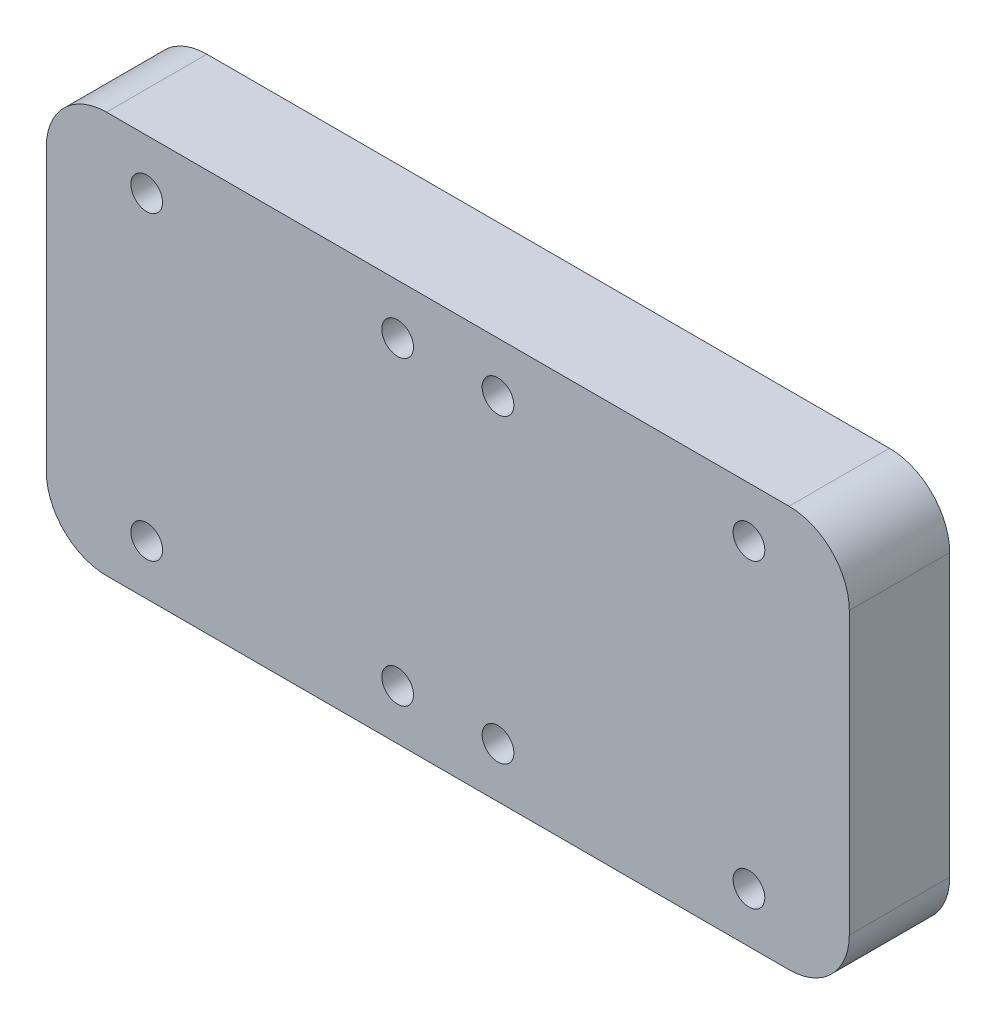
ISO-10303-21;
HEADER;
FILE_DESCRIPTION(('STEP AP214'),'2;1');
FILE_NAME('part.step','',(''),(''),'','','');
FILE_SCHEMA(('AUTOMOTIVE_DESIGN { 1 0 10303 214 1 1 1 1 }'));
ENDSEC;
DATA;
#1=APPLICATION_CONTEXT('core data for automotive mechanical design processes');
#2=APPLICATION_PROTOCOL_DEFINITION('international standard','automotive_design',2000,#1);
#3=PRODUCT_CONTEXT('',#1,'mechanical');
#4=PRODUCT('Part','Part','',(#3));
#5=PRODUCT_RELATED_PRODUCT_CATEGORY('part','',(#4));
#6=PRODUCT_DEFINITION_FORMATION('','',#4);
#7=PRODUCT_DEFINITION_CONTEXT('part definition',#1,'design');
#8=PRODUCT_DEFINITION('design','',#6,#7);
#9=PRODUCT_DEFINITION_SHAPE('','',#8);
#10=(LENGTH_UNIT() NAMED_UNIT(*) SI_UNIT(.MILLI.,.METRE.));
#11=(NAMED_UNIT(*) PLANE_ANGLE_UNIT() SI_UNIT($,.RADIAN.));
#12=(NAMED_UNIT(*) SI_UNIT($,.STERADIAN.) SOLID_ANGLE_UNIT());
#13=UNCERTAINTY_MEASURE_WITH_UNIT(LENGTH_MEASURE(1.E-05),#10,'distance_accuracy_value','');
#14=(GEOMETRIC_REPRESENTATION_CONTEXT(3) GLOBAL_UNCERTAINTY_ASSIGNED_CONTEXT((#13)) GLOBAL_UNIT_ASSIGNED_CONTEXT((#10,
#11,#12)) REPRESENTATION_CONTEXT('',''));
#15=CARTESIAN_POINT('',(0.,0.,0.));
#16=DIRECTION('',(0.,0.,1.));
#17=DIRECTION('',(1.,0.,0.));
#18=AXIS2_PLACEMENT_3D('',#15,#16,#17);
#19=CARTESIAN_POINT('',(0.,0.,5.));
#20=DIRECTION('',(1.,0.,0.));
#21=DIRECTION('',(0.,0.,-1.));
#22=AXIS2_PLACEMENT_3D('',#19,#20,#21);
#23=PLANE('',#22);
#24=DIRECTION('',(0.,-1.,0.));
#25=VECTOR('',#24,1.);
#26=CARTESIAN_POINT('',(0.,0.,0.));
#27=LINE('',#26,#25);
#28=CARTESIAN_POINT('',(0.,17.,0.));
#29=VERTEX_POINT('',#28);
#30=CARTESIAN_POINT('',(0.,3.,0.));
#31=VERTEX_POINT('',#30);
#32=EDGE_CURVE('E128',#29,#31,#27,.T.);
#33=ORIENTED_EDGE('',*,*,#32,.T.);
#34=DIRECTION('',(0.,0.,-1.));
#35=VECTOR('',#34,1.);
#36=CARTESIAN_POINT('',(0.,3.,5.));
#37=LINE('',#36,#35);
#38=CARTESIAN_POINT('',(0.,3.,5.));
#39=VERTEX_POINT('',#38);
#40=EDGE_CURVE('E105',#31,#39,#37,.F.);
#41=ORIENTED_EDGE('',*,*,#40,.T.);
#42=DIRECTION('',(0.,-1.,0.));
#43=VECTOR('',#42,1.);
#44=CARTESIAN_POINT('',(0.,0.,5.));
#45=LINE('',#44,#43);
#46=CARTESIAN_POINT('',(0.,17.,5.));
#47=VERTEX_POINT('',#46);
#48=EDGE_CURVE('E138',#47,#39,#45,.T.);
#49=ORIENTED_EDGE('',*,*,#48,.F.);
#50=DIRECTION('',(0.,0.,-1.));
#51=VECTOR('',#50,1.);
#52=CARTESIAN_POINT('',(0.,17.,5.));
#53=LINE('',#52,#51);
#54=EDGE_CURVE('E110',#47,#29,#53,.T.);
#55=ORIENTED_EDGE('',*,*,#54,.T.);
#56=EDGE_LOOP('',(#33,#41,#49,#55));
#57=FACE_BOUND('',#56,.T.);
#58=ADVANCED_FACE('F33',(#57),#23,.F.);
#59=CARTESIAN_POINT('',(0.,0.,5.));
#60=DIRECTION('',(0.,1.,0.));
#61=DIRECTION('',(0.,0.,1.));
#62=AXIS2_PLACEMENT_3D('',#59,#60,#61);
#63=PLANE('',#62);
#64=DIRECTION('',(1.,0.,0.));
#65=VECTOR('',#64,1.);
#66=CARTESIAN_POINT('',(0.,0.,5.));
#67=LINE('',#66,#65);
#68=CARTESIAN_POINT('',(3.,0.,5.));
#69=VERTEX_POINT('',#68);
#70=CARTESIAN_POINT('',(37.,0.,5.));
#71=VERTEX_POINT('',#70);
#72=EDGE_CURVE('E120',#69,#71,#67,.T.);
#73=ORIENTED_EDGE('',*,*,#72,.F.);
#74=DIRECTION('',(0.,0.,-1.));
#75=VECTOR('',#74,1.);
#76=CARTESIAN_POINT('',(3.,0.,5.));
#77=LINE('',#76,#75);
#78=CARTESIAN_POINT('',(3.,0.,0.));
#79=VERTEX_POINT('',#78);
#80=EDGE_CURVE('E104',#69,#79,#77,.T.);
#81=ORIENTED_EDGE('',*,*,#80,.T.);
#82=DIRECTION('',(1.,0.,0.));
#83=VECTOR('',#82,1.);
#84=CARTESIAN_POINT('',(0.,0.,0.));
#85=LINE('',#84,#83);
#86=CARTESIAN_POINT('',(37.,0.,0.));
#87=VERTEX_POINT('',#86);
#88=EDGE_CURVE('E117',#79,#87,#85,.T.);
#89=ORIENTED_EDGE('',*,*,#88,.T.);
#90=DIRECTION('',(0.,0.,-1.));
#91=VECTOR('',#90,1.);
#92=CARTESIAN_POINT('',(37.,0.,5.));
#93=LINE('',#92,#91);
#94=EDGE_CURVE('E122',#87,#71,#93,.F.);
#95=ORIENTED_EDGE('',*,*,#94,.T.);
#96=EDGE_LOOP('',(#73,#81,#89,#95));
#97=FACE_BOUND('',#96,.T.);
#98=ADVANCED_FACE('F116',(#97),#63,.F.);
#99=CARTESIAN_POINT('',(40.,0.,5.));
#100=DIRECTION('',(-1.,0.,0.));
#101=DIRECTION('',(0.,0.,1.));
#102=AXIS2_PLACEMENT_3D('',#99,#100,#101);
#103=PLANE('',#102);
#104=DIRECTION('',(0.,1.,0.));
#105=VECTOR('',#104,1.);
#106=CARTESIAN_POINT('',(40.,0.,5.));
#107=LINE('',#106,#105);
#108=CARTESIAN_POINT('',(40.,3.,5.));
#109=VERTEX_POINT('',#108);
#110=CARTESIAN_POINT('',(40.,17.,5.));
#111=VERTEX_POINT('',#110);
#112=EDGE_CURVE('E161',#109,#111,#107,.T.);
#113=ORIENTED_EDGE('',*,*,#112,.F.);
#114=DIRECTION('',(0.,0.,-1.));
#115=VECTOR('',#114,1.);
#116=CARTESIAN_POINT('',(40.,3.,5.));
#117=LINE('',#116,#115);
#118=CARTESIAN_POINT('',(40.,3.,0.));
#119=VERTEX_POINT('',#118);
#120=EDGE_CURVE('E11',#109,#119,#117,.T.);
#121=ORIENTED_EDGE('',*,*,#120,.T.);
#122=DIRECTION('',(0.,1.,0.));
#123=VECTOR('',#122,1.);
#124=CARTESIAN_POINT('',(40.,0.,0.));
#125=LINE('',#124,#123);
#126=CARTESIAN_POINT('',(40.,17.,0.));
#127=VERTEX_POINT('',#126);
#128=EDGE_CURVE('E127',#119,#127,#125,.T.);
#129=ORIENTED_EDGE('',*,*,#128,.T.);
#130=DIRECTION('',(0.,0.,-1.));
#131=VECTOR('',#130,1.);
#132=CARTESIAN_POINT('',(40.,17.,5.));
#133=LINE('',#132,#131);
#134=EDGE_CURVE('E41',#127,#111,#133,.F.);
#135=ORIENTED_EDGE('',*,*,#134,.T.);
#136=EDGE_LOOP('',(#113,#121,#129,#135));
#137=FACE_BOUND('',#136,.T.);
#138=ADVANCED_FACE('F160',(#137),#103,.F.);
#139=CARTESIAN_POINT('',(0.,20.,5.));
#140=DIRECTION('',(0.,-1.,0.));
#141=DIRECTION('',(0.,0.,-1.));
#142=AXIS2_PLACEMENT_3D('',#139,#140,#141);
#143=PLANE('',#142);
#144=DIRECTION('',(-1.,0.,0.));
#145=VECTOR('',#144,1.);
#146=CARTESIAN_POINT('',(0.,20.,0.));
#147=LINE('',#146,#145);
#148=CARTESIAN_POINT('',(37.,20.,0.));
#149=VERTEX_POINT('',#148);
#150=CARTESIAN_POINT('',(3.,20.,0.));
#151=VERTEX_POINT('',#150);
#152=EDGE_CURVE('E131',#149,#151,#147,.T.);
#153=ORIENTED_EDGE('',*,*,#152,.T.);
#154=DIRECTION('',(0.,0.,-1.));
#155=VECTOR('',#154,1.);
#156=CARTESIAN_POINT('',(3.,20.,5.));
#157=LINE('',#156,#155);
#158=CARTESIAN_POINT('',(3.,20.,5.));
#159=VERTEX_POINT('',#158);
#160=EDGE_CURVE('E48',#151,#159,#157,.F.);
#161=ORIENTED_EDGE('',*,*,#160,.T.);
#162=DIRECTION('',(-1.,0.,0.));
#163=VECTOR('',#162,1.);
#164=CARTESIAN_POINT('',(0.,20.,5.));
#165=LINE('',#164,#163);
#166=CARTESIAN_POINT('',(37.,20.,5.));
#167=VERTEX_POINT('',#166);
#168=EDGE_CURVE('E139',#167,#159,#165,.T.);
#169=ORIENTED_EDGE('',*,*,#168,.F.);
#170=DIRECTION('',(0.,0.,-1.));
#171=VECTOR('',#170,1.);
#172=CARTESIAN_POINT('',(37.,20.,5.));
#173=LINE('',#172,#171);
#174=EDGE_CURVE('E154',#167,#149,#173,.T.);
#175=ORIENTED_EDGE('',*,*,#174,.T.);
#176=EDGE_LOOP('',(#153,#161,#169,#175));
#177=FACE_BOUND('',#176,.T.);
#178=ADVANCED_FACE('F170',(#177),#143,.F.);
#179=CARTESIAN_POINT('',(0.,0.,5.));
#180=DIRECTION('',(0.,0.,-1.));
#181=DIRECTION('',(-1.,0.,0.));
#182=AXIS2_PLACEMENT_3D('',#179,#180,#181);
#183=PLANE('',#182);
#184=CARTESIAN_POINT('',(5.,2.5,5.));
#185=DIRECTION('',(0.,0.,1.));
#186=DIRECTION('',(1.,0.,0.));
#187=AXIS2_PLACEMENT_3D('',#184,#185,#186);
#188=CIRCLE('',#187,0.79);
#189=CARTESIAN_POINT('',(5.79,2.5,5.));
#190=VERTEX_POINT('',#189);
#191=EDGE_CURVE('E222',#190,#190,#188,.T.);
#192=ORIENTED_EDGE('',*,*,#191,.F.);
#193=EDGE_LOOP('',(#192));
#194=FACE_BOUND('',#193,.T.);
#195=CARTESIAN_POINT('',(17.5,2.50000000000001,5.));
#196=DIRECTION('',(0.,0.,1.));
#197=DIRECTION('',(1.,0.,0.));
#198=AXIS2_PLACEMENT_3D('',#195,#196,#197);
#199=CIRCLE('',#198,0.789999999999999);
#200=CARTESIAN_POINT('',(18.29,2.50000000000001,5.));
#201=VERTEX_POINT('',#200);
#202=EDGE_CURVE('E216',#201,#201,#199,.T.);
#203=ORIENTED_EDGE('',*,*,#202,.F.);
#204=EDGE_LOOP('',(#203));
#205=FACE_BOUND('',#204,.T.);
#206=CARTESIAN_POINT('',(17.5,17.5,5.));
#207=DIRECTION('',(0.,0.,1.));
#208=DIRECTION('',(1.,0.,0.));
#209=AXIS2_PLACEMENT_3D('',#206,#207,#208);
#210=CIRCLE('',#209,0.789999999999999);
#211=CARTESIAN_POINT('',(18.29,17.5,5.));
#212=VERTEX_POINT('',#211);
#213=EDGE_CURVE('E210',#212,#212,#210,.T.);
#214=ORIENTED_EDGE('',*,*,#213,.F.);
#215=EDGE_LOOP('',(#214));
#216=FACE_BOUND('',#215,.T.);
#217=CARTESIAN_POINT('',(22.5,17.5,5.));
#218=DIRECTION('',(0.,0.,1.));
#219=DIRECTION('',(-1.,0.,0.));
#220=AXIS2_PLACEMENT_3D('',#217,#218,#219);
#221=CIRCLE('',#220,0.789999999999999);
#222=CARTESIAN_POINT('',(21.71,17.5,5.));
#223=VERTEX_POINT('',#222);
#224=EDGE_CURVE('E204',#223,#223,#221,.T.);
#225=ORIENTED_EDGE('',*,*,#224,.F.);
#226=EDGE_LOOP('',(#225));
#227=FACE_BOUND('',#226,.T.);
#228=CARTESIAN_POINT('',(22.5,2.50000000000001,5.));
#229=DIRECTION('',(0.,0.,1.));
#230=DIRECTION('',(-1.,0.,0.));
#231=AXIS2_PLACEMENT_3D('',#228,#229,#230);
#232=CIRCLE('',#231,0.789999999999999);
#233=CARTESIAN_POINT('',(21.71,2.50000000000001,5.));
#234=VERTEX_POINT('',#233);
#235=EDGE_CURVE('E198',#234,#234,#232,.T.);
#236=ORIENTED_EDGE('',*,*,#235,.F.);
#237=EDGE_LOOP('',(#236));
#238=FACE_BOUND('',#237,.T.);
#239=CARTESIAN_POINT('',(35.,2.5,5.));
#240=DIRECTION('',(0.,0.,1.));
#241=DIRECTION('',(-1.,0.,0.));
#242=AXIS2_PLACEMENT_3D('',#239,#240,#241);
#243=CIRCLE('',#242,0.789999999999999);
#244=CARTESIAN_POINT('',(34.21,2.5,5.));
#245=VERTEX_POINT('',#244);
#246=EDGE_CURVE('E192',#245,#245,#243,.T.);
#247=ORIENTED_EDGE('',*,*,#246,.F.);
#248=EDGE_LOOP('',(#247));
#249=FACE_BOUND('',#248,.T.);
#250=CARTESIAN_POINT('',(35.,17.5,5.));
#251=DIRECTION('',(0.,0.,1.));
#252=DIRECTION('',(-1.,0.,0.));
#253=AXIS2_PLACEMENT_3D('',#250,#251,#252);
#254=CIRCLE('',#253,0.789999999999999);
#255=CARTESIAN_POINT('',(34.21,17.5,5.));
#256=VERTEX_POINT('',#255);
#257=EDGE_CURVE('E186',#256,#256,#254,.T.);
#258=ORIENTED_EDGE('',*,*,#257,.F.);
#259=EDGE_LOOP('',(#258));
#260=FACE_BOUND('',#259,.T.);
#261=CARTESIAN_POINT('',(5.,17.5,5.));
#262=DIRECTION('',(0.,0.,1.));
#263=DIRECTION('',(1.,0.,0.));
#264=AXIS2_PLACEMENT_3D('',#261,#262,#263);
#265=CIRCLE('',#264,0.79);
#266=CARTESIAN_POINT('',(5.79,17.5,5.));
#267=VERTEX_POINT('',#266);
#268=EDGE_CURVE('E180',#267,#267,#265,.T.);
#269=ORIENTED_EDGE('',*,*,#268,.F.);
#270=EDGE_LOOP('',(#269));
#271=FACE_BOUND('',#270,.T.);
#272=ORIENTED_EDGE('',*,*,#48,.T.);
#273=CARTESIAN_POINT('',(3.,3.,5.));
#274=DIRECTION('',(0.,0.,-1.));
#275=DIRECTION('',(-1.,0.,0.));
#276=AXIS2_PLACEMENT_3D('',#273,#274,#275);
#277=CIRCLE('',#276,3.);
#278=EDGE_CURVE('E152',#39,#69,#277,.F.);
#279=ORIENTED_EDGE('',*,*,#278,.T.);
#280=ORIENTED_EDGE('',*,*,#72,.T.);
#281=CARTESIAN_POINT('',(37.,3.,5.));
#282=DIRECTION('',(0.,0.,-1.));
#283=DIRECTION('',(-1.,0.,0.));
#284=AXIS2_PLACEMENT_3D('',#281,#282,#283);
#285=CIRCLE('',#284,3.);
#286=EDGE_CURVE('E148',#71,#109,#285,.F.);
#287=ORIENTED_EDGE('',*,*,#286,.T.);
#288=ORIENTED_EDGE('',*,*,#112,.T.);
#289=CARTESIAN_POINT('',(37.,17.,5.));
#290=DIRECTION('',(0.,0.,-1.));
#291=DIRECTION('',(-1.,0.,0.));
#292=AXIS2_PLACEMENT_3D('',#289,#290,#291);
#293=CIRCLE('',#292,3.);
#294=EDGE_CURVE('E55',#111,#167,#293,.F.);
#295=ORIENTED_EDGE('',*,*,#294,.T.);
#296=ORIENTED_EDGE('',*,*,#168,.T.);
#297=CARTESIAN_POINT('',(3.,17.,5.));
#298=DIRECTION('',(0.,0.,-1.));
#299=DIRECTION('',(-1.,0.,0.));
#300=AXIS2_PLACEMENT_3D('',#297,#298,#299);
#301=CIRCLE('',#300,3.);
#302=EDGE_CURVE('E150',#159,#47,#301,.F.);
#303=ORIENTED_EDGE('',*,*,#302,.T.);
#304=EDGE_LOOP('',(#272,#279,#280,#287,#288,#295,#296,#303));
#305=FACE_BOUND('',#304,.T.);
#306=ADVANCED_FACE('F165',(#194,#205,#216,#227,#238,#249,#260,#271,#305),#183,.F.);
#307=CARTESIAN_POINT('',(0.,0.,0.));
#308=DIRECTION('',(0.,0.,-1.));
#309=DIRECTION('',(-1.,0.,0.));
#310=AXIS2_PLACEMENT_3D('',#307,#308,#309);
#311=PLANE('',#310);
#312=CARTESIAN_POINT('',(5.,2.5,0.));
#313=DIRECTION('',(0.,0.,1.));
#314=DIRECTION('',(1.,0.,0.));
#315=AXIS2_PLACEMENT_3D('',#312,#313,#314);
#316=CIRCLE('',#315,0.79);
#317=CARTESIAN_POINT('',(5.79,2.5,0.));
#318=VERTEX_POINT('',#317);
#319=EDGE_CURVE('E183',#318,#318,#316,.T.);
#320=ORIENTED_EDGE('',*,*,#319,.T.);
#321=EDGE_LOOP('',(#320));
#322=FACE_BOUND('',#321,.T.);
#323=CARTESIAN_POINT('',(17.5,2.50000000000001,0.));
#324=DIRECTION('',(0.,0.,1.));
#325=DIRECTION('',(1.,0.,0.));
#326=AXIS2_PLACEMENT_3D('',#323,#324,#325);
#327=CIRCLE('',#326,0.789999999999999);
#328=CARTESIAN_POINT('',(18.29,2.50000000000001,0.));
#329=VERTEX_POINT('',#328);
#330=EDGE_CURVE('E219',#329,#329,#327,.T.);
#331=ORIENTED_EDGE('',*,*,#330,.T.);
#332=EDGE_LOOP('',(#331));
#333=FACE_BOUND('',#332,.T.);
#334=CARTESIAN_POINT('',(17.5,17.5,0.));
#335=DIRECTION('',(0.,0.,1.));
#336=DIRECTION('',(1.,0.,0.));
#337=AXIS2_PLACEMENT_3D('',#334,#335,#336);
#338=CIRCLE('',#337,0.789999999999999);
#339=CARTESIAN_POINT('',(18.29,17.5,0.));
#340=VERTEX_POINT('',#339);
#341=EDGE_CURVE('E213',#340,#340,#338,.T.);
#342=ORIENTED_EDGE('',*,*,#341,.T.);
#343=EDGE_LOOP('',(#342));
#344=FACE_BOUND('',#343,.T.);
#345=CARTESIAN_POINT('',(22.5,17.5,0.));
#346=DIRECTION('',(0.,0.,1.));
#347=DIRECTION('',(-1.,0.,0.));
#348=AXIS2_PLACEMENT_3D('',#345,#346,#347);
#349=CIRCLE('',#348,0.789999999999999);
#350=CARTESIAN_POINT('',(21.71,17.5,0.));
#351=VERTEX_POINT('',#350);
#352=EDGE_CURVE('E207',#351,#351,#349,.T.);
#353=ORIENTED_EDGE('',*,*,#352,.T.);
#354=EDGE_LOOP('',(#353));
#355=FACE_BOUND('',#354,.T.);
#356=CARTESIAN_POINT('',(22.5,2.50000000000001,0.));
#357=DIRECTION('',(0.,0.,1.));
#358=DIRECTION('',(-1.,0.,0.));
#359=AXIS2_PLACEMENT_3D('',#356,#357,#358);
#360=CIRCLE('',#359,0.789999999999999);
#361=CARTESIAN_POINT('',(21.71,2.50000000000001,0.));
#362=VERTEX_POINT('',#361);
#363=EDGE_CURVE('E201',#362,#362,#360,.T.);
#364=ORIENTED_EDGE('',*,*,#363,.T.);
#365=EDGE_LOOP('',(#364));
#366=FACE_BOUND('',#365,.T.);
#367=CARTESIAN_POINT('',(35.,2.5,0.));
#368=DIRECTION('',(0.,0.,1.));
#369=DIRECTION('',(-1.,0.,0.));
#370=AXIS2_PLACEMENT_3D('',#367,#368,#369);
#371=CIRCLE('',#370,0.789999999999999);
#372=CARTESIAN_POINT('',(34.21,2.5,0.));
#373=VERTEX_POINT('',#372);
#374=EDGE_CURVE('E195',#373,#373,#371,.T.);
#375=ORIENTED_EDGE('',*,*,#374,.T.);
#376=EDGE_LOOP('',(#375));
#377=FACE_BOUND('',#376,.T.);
#378=CARTESIAN_POINT('',(35.,17.5,0.));
#379=DIRECTION('',(0.,0.,1.));
#380=DIRECTION('',(-1.,0.,0.));
#381=AXIS2_PLACEMENT_3D('',#378,#379,#380);
#382=CIRCLE('',#381,0.789999999999999);
#383=CARTESIAN_POINT('',(34.21,17.5,0.));
#384=VERTEX_POINT('',#383);
#385=EDGE_CURVE('E189',#384,#384,#382,.T.);
#386=ORIENTED_EDGE('',*,*,#385,.T.);
#387=EDGE_LOOP('',(#386));
#388=FACE_BOUND('',#387,.T.);
#389=CARTESIAN_POINT('',(5.,17.5,0.));
#390=DIRECTION('',(0.,0.,1.));
#391=DIRECTION('',(1.,0.,0.));
#392=AXIS2_PLACEMENT_3D('',#389,#390,#391);
#393=CIRCLE('',#392,0.79);
#394=CARTESIAN_POINT('',(5.79,17.5,0.));
#395=VERTEX_POINT('',#394);
#396=EDGE_CURVE('E133',#395,#395,#393,.T.);
#397=ORIENTED_EDGE('',*,*,#396,.T.);
#398=EDGE_LOOP('',(#397));
#399=FACE_BOUND('',#398,.T.);
#400=ORIENTED_EDGE('',*,*,#88,.F.);
#401=CARTESIAN_POINT('',(3.,3.,0.));
#402=DIRECTION('',(0.,0.,-1.));
#403=DIRECTION('',(-1.,0.,0.));
#404=AXIS2_PLACEMENT_3D('',#401,#402,#403);
#405=CIRCLE('',#404,3.);
#406=EDGE_CURVE('E100',#79,#31,#405,.T.);
#407=ORIENTED_EDGE('',*,*,#406,.T.);
#408=ORIENTED_EDGE('',*,*,#32,.F.);
#409=CARTESIAN_POINT('',(3.,17.,0.));
#410=DIRECTION('',(0.,0.,-1.));
#411=DIRECTION('',(-1.,0.,0.));
#412=AXIS2_PLACEMENT_3D('',#409,#410,#411);
#413=CIRCLE('',#412,3.);
#414=EDGE_CURVE('E111',#29,#151,#413,.T.);
#415=ORIENTED_EDGE('',*,*,#414,.T.);
#416=ORIENTED_EDGE('',*,*,#152,.F.);
#417=CARTESIAN_POINT('',(37.,17.,0.));
#418=DIRECTION('',(0.,0.,-1.));
#419=DIRECTION('',(-1.,0.,0.));
#420=AXIS2_PLACEMENT_3D('',#417,#418,#419);
#421=CIRCLE('',#420,3.);
#422=EDGE_CURVE('E121',#149,#127,#421,.T.);
#423=ORIENTED_EDGE('',*,*,#422,.T.);
#424=ORIENTED_EDGE('',*,*,#128,.F.);
#425=CARTESIAN_POINT('',(37.,3.,0.));
#426=DIRECTION('',(0.,0.,-1.));
#427=DIRECTION('',(-1.,0.,0.));
#428=AXIS2_PLACEMENT_3D('',#425,#426,#427);
#429=CIRCLE('',#428,3.);
#430=EDGE_CURVE('E126',#119,#87,#429,.T.);
#431=ORIENTED_EDGE('',*,*,#430,.T.);
#432=EDGE_LOOP('',(#400,#407,#408,#415,#416,#423,#424,#431));
#433=FACE_BOUND('',#432,.T.);
#434=ADVANCED_FACE('F124',(#322,#333,#344,#355,#366,#377,#388,#399,#433),#311,.T.);
#435=CARTESIAN_POINT('',(3.,3.,5.));
#436=DIRECTION('',(0.,0.,-1.));
#437=DIRECTION('',(-1.,0.,0.));
#438=AXIS2_PLACEMENT_3D('',#435,#436,#437);
#439=CYLINDRICAL_SURFACE('',#438,3.);
#440=ORIENTED_EDGE('',*,*,#278,.F.);
#441=ORIENTED_EDGE('',*,*,#40,.F.);
#442=ORIENTED_EDGE('',*,*,#406,.F.);
#443=ORIENTED_EDGE('',*,*,#80,.F.);
#444=EDGE_LOOP('',(#440,#441,#442,#443));
#445=FACE_BOUND('',#444,.T.);
#446=ADVANCED_FACE('F103',(#445),#439,.T.);
#447=CARTESIAN_POINT('',(3.,17.,5.));
#448=DIRECTION('',(0.,0.,-1.));
#449=DIRECTION('',(-1.,0.,0.));
#450=AXIS2_PLACEMENT_3D('',#447,#448,#449);
#451=CYLINDRICAL_SURFACE('',#450,3.);
#452=ORIENTED_EDGE('',*,*,#302,.F.);
#453=ORIENTED_EDGE('',*,*,#160,.F.);
#454=ORIENTED_EDGE('',*,*,#414,.F.);
#455=ORIENTED_EDGE('',*,*,#54,.F.);
#456=EDGE_LOOP('',(#452,#453,#454,#455));
#457=FACE_BOUND('',#456,.T.);
#458=ADVANCED_FACE('F174',(#457),#451,.T.);
#459=CARTESIAN_POINT('',(37.,3.,5.));
#460=DIRECTION('',(0.,0.,-1.));
#461=DIRECTION('',(-1.,0.,0.));
#462=AXIS2_PLACEMENT_3D('',#459,#460,#461);
#463=CYLINDRICAL_SURFACE('',#462,3.);
#464=ORIENTED_EDGE('',*,*,#286,.F.);
#465=ORIENTED_EDGE('',*,*,#94,.F.);
#466=ORIENTED_EDGE('',*,*,#430,.F.);
#467=ORIENTED_EDGE('',*,*,#120,.F.);
#468=EDGE_LOOP('',(#464,#465,#466,#467));
#469=FACE_BOUND('',#468,.T.);
#470=ADVANCED_FACE('F266',(#469),#463,.T.);
#471=CARTESIAN_POINT('',(37.,17.,5.));
#472=DIRECTION('',(0.,0.,-1.));
#473=DIRECTION('',(-1.,0.,0.));
#474=AXIS2_PLACEMENT_3D('',#471,#472,#473);
#475=CYLINDRICAL_SURFACE('',#474,3.);
#476=ORIENTED_EDGE('',*,*,#294,.F.);
#477=ORIENTED_EDGE('',*,*,#134,.F.);
#478=ORIENTED_EDGE('',*,*,#422,.F.);
#479=ORIENTED_EDGE('',*,*,#174,.F.);
#480=EDGE_LOOP('',(#476,#477,#478,#479));
#481=FACE_BOUND('',#480,.T.);
#482=ADVANCED_FACE('F35',(#481),#475,.T.);
#483=CARTESIAN_POINT('',(5.,17.5,0.));
#484=DIRECTION('',(0.,0.,1.));
#485=DIRECTION('',(1.,0.,0.));
#486=AXIS2_PLACEMENT_3D('',#483,#484,#485);
#487=CYLINDRICAL_SURFACE('',#486,0.79);
#488=ORIENTED_EDGE('',*,*,#396,.F.);
#489=EDGE_LOOP('',(#488));
#490=FACE_BOUND('',#489,.T.);
#491=ORIENTED_EDGE('',*,*,#268,.T.);
#492=EDGE_LOOP('',(#491));
#493=FACE_BOUND('',#492,.T.);
#494=ADVANCED_FACE('F254',(#490,#493),#487,.F.);
#495=CARTESIAN_POINT('',(35.,17.5,0.));
#496=DIRECTION('',(0.,0.,1.));
#497=DIRECTION('',(1.,0.,0.));
#498=AXIS2_PLACEMENT_3D('',#495,#496,#497);
#499=CYLINDRICAL_SURFACE('',#498,0.789999999999999);
#500=ORIENTED_EDGE('',*,*,#385,.F.);
#501=EDGE_LOOP('',(#500));
#502=FACE_BOUND('',#501,.T.);
#503=ORIENTED_EDGE('',*,*,#257,.T.);
#504=EDGE_LOOP('',(#503));
#505=FACE_BOUND('',#504,.T.);
#506=ADVANCED_FACE('F256',(#502,#505),#499,.F.);
#507=CARTESIAN_POINT('',(35.,2.5,0.));
#508=DIRECTION('',(0.,0.,1.));
#509=DIRECTION('',(1.,0.,0.));
#510=AXIS2_PLACEMENT_3D('',#507,#508,#509);
#511=CYLINDRICAL_SURFACE('',#510,0.789999999999999);
#512=ORIENTED_EDGE('',*,*,#374,.F.);
#513=EDGE_LOOP('',(#512));
#514=FACE_BOUND('',#513,.T.);
#515=ORIENTED_EDGE('',*,*,#246,.T.);
#516=EDGE_LOOP('',(#515));
#517=FACE_BOUND('',#516,.T.);
#518=ADVANCED_FACE('F263',(#514,#517),#511,.F.);
#519=CARTESIAN_POINT('',(22.5,2.50000000000001,0.));
#520=DIRECTION('',(0.,0.,1.));
#521=DIRECTION('',(1.,0.,0.));
#522=AXIS2_PLACEMENT_3D('',#519,#520,#521);
#523=CYLINDRICAL_SURFACE('',#522,0.789999999999999);
#524=ORIENTED_EDGE('',*,*,#363,.F.);
#525=EDGE_LOOP('',(#524));
#526=FACE_BOUND('',#525,.T.);
#527=ORIENTED_EDGE('',*,*,#235,.T.);
#528=EDGE_LOOP('',(#527));
#529=FACE_BOUND('',#528,.T.);
#530=ADVANCED_FACE('F325',(#526,#529),#523,.F.);
#531=CARTESIAN_POINT('',(22.5,17.5,0.));
#532=DIRECTION('',(0.,0.,1.));
#533=DIRECTION('',(1.,0.,0.));
#534=AXIS2_PLACEMENT_3D('',#531,#532,#533);
#535=CYLINDRICAL_SURFACE('',#534,0.789999999999999);
#536=ORIENTED_EDGE('',*,*,#352,.F.);
#537=EDGE_LOOP('',(#536));
#538=FACE_BOUND('',#537,.T.);
#539=ORIENTED_EDGE('',*,*,#224,.T.);
#540=EDGE_LOOP('',(#539));
#541=FACE_BOUND('',#540,.T.);
#542=ADVANCED_FACE('F335',(#538,#541),#535,.F.);
#543=CARTESIAN_POINT('',(17.5,17.5,0.));
#544=DIRECTION('',(0.,0.,1.));
#545=DIRECTION('',(1.,0.,0.));
#546=AXIS2_PLACEMENT_3D('',#543,#544,#545);
#547=CYLINDRICAL_SURFACE('',#546,0.789999999999999);
#548=ORIENTED_EDGE('',*,*,#341,.F.);
#549=EDGE_LOOP('',(#548));
#550=FACE_BOUND('',#549,.T.);
#551=ORIENTED_EDGE('',*,*,#213,.T.);
#552=EDGE_LOOP('',(#551));
#553=FACE_BOUND('',#552,.T.);
#554=ADVANCED_FACE('F345',(#550,#553),#547,.F.);
#555=CARTESIAN_POINT('',(17.5,2.50000000000001,0.));
#556=DIRECTION('',(0.,0.,1.));
#557=DIRECTION('',(1.,0.,0.));
#558=AXIS2_PLACEMENT_3D('',#555,#556,#557);
#559=CYLINDRICAL_SURFACE('',#558,0.789999999999999);
#560=ORIENTED_EDGE('',*,*,#330,.F.);
#561=EDGE_LOOP('',(#560));
#562=FACE_BOUND('',#561,.T.);
#563=ORIENTED_EDGE('',*,*,#202,.T.);
#564=EDGE_LOOP('',(#563));
#565=FACE_BOUND('',#564,.T.);
#566=ADVANCED_FACE('F233',(#562,#565),#559,.F.);
#567=CARTESIAN_POINT('',(5.,2.5,0.));
#568=DIRECTION('',(0.,0.,1.));
#569=DIRECTION('',(1.,0.,0.));
#570=AXIS2_PLACEMENT_3D('',#567,#568,#569);
#571=CYLINDRICAL_SURFACE('',#570,0.79);
#572=ORIENTED_EDGE('',*,*,#319,.F.);
#573=EDGE_LOOP('',(#572));
#574=FACE_BOUND('',#573,.T.);
#575=ORIENTED_EDGE('',*,*,#191,.T.);
#576=EDGE_LOOP('',(#575));
#577=FACE_BOUND('',#576,.T.);
#578=ADVANCED_FACE('F230',(#574,#577),#571,.F.);
#579=CLOSED_SHELL('',(#58,#98,#138,#178,#306,#434,#446,#458,#470,#482,#494,#506,#518,#530,#542,
#554,#566,#578));
#580=MANIFOLD_SOLID_BREP('B2',#579);
#581=ADVANCED_BREP_SHAPE_REPRESENTATION('',(#18,#580),#14);
#582=SHAPE_DEFINITION_REPRESENTATION(#9,#581);
ENDSEC;
END-ISO-10303-21;
